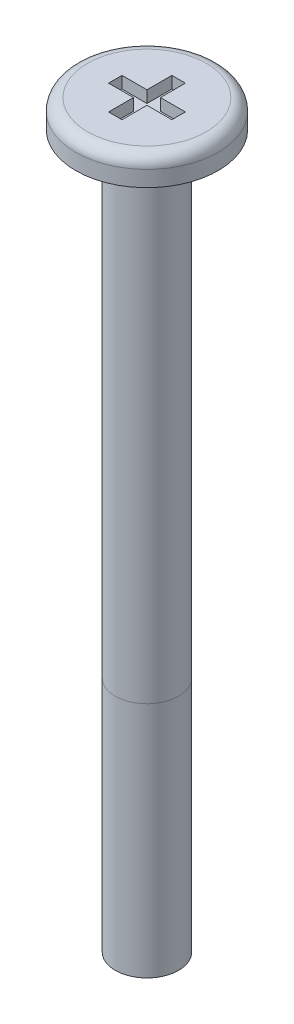
ISO-10303-21;
HEADER;
FILE_DESCRIPTION(('STEP AP214'),'2;1');
FILE_NAME('part.step','',(''),(''),'','','');
FILE_SCHEMA(('AUTOMOTIVE_DESIGN { 1 0 10303 214 1 1 1 1 }'));
ENDSEC;
DATA;
#1=APPLICATION_CONTEXT('core data for automotive mechanical design processes');
#2=APPLICATION_PROTOCOL_DEFINITION('international standard','automotive_design',2000,#1);
#3=PRODUCT_CONTEXT('',#1,'mechanical');
#4=PRODUCT('Part','Part','',(#3));
#5=PRODUCT_RELATED_PRODUCT_CATEGORY('part','',(#4));
#6=PRODUCT_DEFINITION_FORMATION('','',#4);
#7=PRODUCT_DEFINITION_CONTEXT('part definition',#1,'design');
#8=PRODUCT_DEFINITION('design','',#6,#7);
#9=PRODUCT_DEFINITION_SHAPE('','',#8);
#10=(LENGTH_UNIT() NAMED_UNIT(*) SI_UNIT(.MILLI.,.METRE.));
#11=(NAMED_UNIT(*) PLANE_ANGLE_UNIT() SI_UNIT($,.RADIAN.));
#12=(NAMED_UNIT(*) SI_UNIT($,.STERADIAN.) SOLID_ANGLE_UNIT());
#13=UNCERTAINTY_MEASURE_WITH_UNIT(LENGTH_MEASURE(1.E-05),#10,'distance_accuracy_value','');
#14=(GEOMETRIC_REPRESENTATION_CONTEXT(3) GLOBAL_UNCERTAINTY_ASSIGNED_CONTEXT((#13)) GLOBAL_UNIT_ASSIGNED_CONTEXT((#10,
#11,#12)) REPRESENTATION_CONTEXT('',''));
#15=CARTESIAN_POINT('',(0.,0.,0.));
#16=DIRECTION('',(0.,0.,1.));
#17=DIRECTION('',(1.,0.,0.));
#18=AXIS2_PLACEMENT_3D('',#15,#16,#17);
#19=CARTESIAN_POINT('',(0.,45.,0.));
#20=DIRECTION('',(0.,-1.,0.));
#21=DIRECTION('',(0.,0.,-1.));
#22=AXIS2_PLACEMENT_3D('',#19,#20,#21);
#23=CYLINDRICAL_SURFACE('',#22,2.);
#24=CARTESIAN_POINT('',(0.,0.,0.));
#25=DIRECTION('',(0.,1.,0.));
#26=DIRECTION('',(0.,0.,1.));
#27=AXIS2_PLACEMENT_3D('',#24,#25,#26);
#28=CIRCLE('',#27,2.);
#29=CARTESIAN_POINT('',(0.,0.,-2.));
#30=VERTEX_POINT('',#29);
#31=EDGE_CURVE('E213',#30,#30,#28,.T.);
#32=CARTESIAN_POINT('',(0.,15.,0.));
#33=DIRECTION('',(0.,1.,0.));
#34=DIRECTION('',(0.,0.,1.));
#35=AXIS2_PLACEMENT_3D('',#32,#33,#34);
#36=CIRCLE('',#35,2.);
#37=CARTESIAN_POINT('',(0.,15.,-2.));
#38=VERTEX_POINT('',#37);
#39=EDGE_CURVE('E11',#38,#38,#36,.T.);
#40=CARTESIAN_POINT('',(0.,0.,-2.));
#41=CARTESIAN_POINT('',(0.,0.156249999999992,-2.));
#42=CARTESIAN_POINT('',(0.,0.312499999999991,-2.));
#43=CARTESIAN_POINT('',(0.,0.624999999999991,-2.));
#44=CARTESIAN_POINT('',(0.,0.781249999999993,-2.));
#45=CARTESIAN_POINT('',(0.,1.09374999999999,-2.));
#46=CARTESIAN_POINT('',(0.,1.24999999999999,-2.));
#47=CARTESIAN_POINT('',(0.,1.56249999999999,-2.));
#48=CARTESIAN_POINT('',(0.,1.71874999999999,-2.));
#49=CARTESIAN_POINT('',(0.,2.03124999999999,-2.));
#50=CARTESIAN_POINT('',(0.,2.18749999999999,-2.));
#51=CARTESIAN_POINT('',(0.,2.49999999999999,-2.));
#52=CARTESIAN_POINT('',(0.,2.65624999999999,-2.));
#53=CARTESIAN_POINT('',(0.,2.96874999999999,-2.));
#54=CARTESIAN_POINT('',(0.,3.12499999999999,-2.));
#55=CARTESIAN_POINT('',(0.,3.43749999999999,-2.));
#56=CARTESIAN_POINT('',(0.,3.59374999999999,-2.));
#57=CARTESIAN_POINT('',(0.,3.90624999999999,-2.));
#58=CARTESIAN_POINT('',(0.,4.06249999999999,-2.));
#59=CARTESIAN_POINT('',(0.,4.37499999999999,-2.));
#60=CARTESIAN_POINT('',(0.,4.53124999999999,-2.));
#61=CARTESIAN_POINT('',(0.,4.84374999999999,-2.));
#62=CARTESIAN_POINT('',(0.,4.99999999999999,-2.));
#63=CARTESIAN_POINT('',(0.,5.31249999999999,-2.));
#64=CARTESIAN_POINT('',(0.,5.46874999999999,-2.));
#65=CARTESIAN_POINT('',(0.,5.78124999999999,-2.));
#66=CARTESIAN_POINT('',(0.,5.93749999999999,-2.));
#67=CARTESIAN_POINT('',(0.,6.24999999999999,-2.));
#68=CARTESIAN_POINT('',(0.,6.40624999999999,-2.));
#69=CARTESIAN_POINT('',(0.,6.71874999999999,-2.));
#70=CARTESIAN_POINT('',(0.,6.87499999999999,-2.));
#71=CARTESIAN_POINT('',(0.,7.18749999999999,-2.));
#72=CARTESIAN_POINT('',(0.,7.34374999999999,-2.));
#73=CARTESIAN_POINT('',(0.,7.65624999999999,-2.));
#74=CARTESIAN_POINT('',(0.,7.81249999999999,-2.));
#75=CARTESIAN_POINT('',(0.,8.12499999999999,-2.));
#76=CARTESIAN_POINT('',(0.,8.28124999999999,-2.));
#77=CARTESIAN_POINT('',(0.,8.59374999999999,-2.));
#78=CARTESIAN_POINT('',(0.,8.74999999999999,-2.));
#79=CARTESIAN_POINT('',(0.,9.06249999999999,-2.));
#80=CARTESIAN_POINT('',(0.,9.21874999999999,-2.));
#81=CARTESIAN_POINT('',(0.,9.53124999999999,-2.));
#82=CARTESIAN_POINT('',(0.,9.68749999999999,-2.));
#83=CARTESIAN_POINT('',(0.,9.99999999999999,-2.));
#84=CARTESIAN_POINT('',(0.,10.15625,-2.));
#85=CARTESIAN_POINT('',(0.,10.46875,-2.));
#86=CARTESIAN_POINT('',(0.,10.625,-2.));
#87=CARTESIAN_POINT('',(0.,10.9375,-2.));
#88=CARTESIAN_POINT('',(0.,11.09375,-2.));
#89=CARTESIAN_POINT('',(0.,11.40625,-2.));
#90=CARTESIAN_POINT('',(0.,11.5625,-2.));
#91=CARTESIAN_POINT('',(0.,11.875,-2.));
#92=CARTESIAN_POINT('',(0.,12.03125,-2.));
#93=CARTESIAN_POINT('',(0.,12.34375,-2.));
#94=CARTESIAN_POINT('',(0.,12.5,-2.));
#95=CARTESIAN_POINT('',(0.,12.8125,-2.));
#96=CARTESIAN_POINT('',(0.,12.96875,-2.));
#97=CARTESIAN_POINT('',(0.,13.28125,-2.));
#98=CARTESIAN_POINT('',(0.,13.4375,-2.));
#99=CARTESIAN_POINT('',(0.,13.75,-2.));
#100=CARTESIAN_POINT('',(0.,13.90625,-2.));
#101=CARTESIAN_POINT('',(0.,14.21875,-2.));
#102=CARTESIAN_POINT('',(0.,14.375,-2.));
#103=CARTESIAN_POINT('',(0.,14.6875,-2.));
#104=CARTESIAN_POINT('',(0.,14.84375,-2.));
#105=CARTESIAN_POINT('',(0.,15.,-2.));
#106=B_SPLINE_CURVE_WITH_KNOTS('',3,(#40,#41,#42,#43,#44,#45,#46,#47,#48,#49,#50,#51,#52,#53,
#54,#55,#56,#57,#58,#59,#60,#61,#62,#63,#64,#65,#66,#67,#68,#69,#70,#71,#72,#73,#74,#75,#76,#77,
#78,#79,#80,#81,#82,#83,#84,#85,#86,#87,#88,#89,#90,#91,#92,#93,#94,#95,#96,#97,#98,#99,#100,
#101,#102,#103,#104,#105),.UNSPECIFIED.,.F.,.F.,(4,2,2,2,2,2,2,2,2,2,2,2,2,2,2,2,2,2,2,2,2,2,2,
2,2,2,2,2,2,2,2,2,4),(0.,0.468749999999997,0.937500000000001,1.40625,1.875,2.34375,2.8125,
3.28125,3.75,4.21875,4.6875,5.15625,5.625,6.09374999999999,6.5625,7.03125,7.49999999999999,
7.96875,8.43749999999999,8.90625,9.37499999999999,9.84375,10.3125,10.78125,11.25,11.71875,
12.1875,12.65625,13.125,13.59375,14.0625,14.53125,15.),.UNSPECIFIED.);
#107=EDGE_CURVE('BSEAM36',#30,#38,#106,.T.);
#108=ORIENTED_EDGE('',*,*,#31,.T.);
#109=ORIENTED_EDGE('',*,*,#39,.F.);
#110=ORIENTED_EDGE('',*,*,#107,.T.);
#111=ORIENTED_EDGE('',*,*,#107,.F.);
#112=EDGE_LOOP('',(#108,#110,#109,#111));
#113=FACE_BOUND('',#112,.T.);
#114=ADVANCED_FACE('F36',(#113),#23,.T.);
#115=CARTESIAN_POINT('',(0.,45.,0.));
#116=DIRECTION('',(0.,1.,0.));
#117=DIRECTION('',(0.,0.,1.));
#118=AXIS2_PLACEMENT_3D('',#115,#116,#117);
#119=CIRCLE('',#118,2.);
#120=CARTESIAN_POINT('',(0.,45.,-2.));
#121=VERTEX_POINT('',#120);
#122=EDGE_CURVE('E214',#121,#121,#119,.T.);
#123=CARTESIAN_POINT('',(0.,15.,-2.));
#124=CARTESIAN_POINT('',(0.,15.3125,-2.));
#125=CARTESIAN_POINT('',(0.,15.625,-2.));
#126=CARTESIAN_POINT('',(0.,16.25,-2.));
#127=CARTESIAN_POINT('',(0.,16.5625,-2.));
#128=CARTESIAN_POINT('',(0.,17.1875,-2.));
#129=CARTESIAN_POINT('',(0.,17.5,-2.));
#130=CARTESIAN_POINT('',(0.,18.125,-2.));
#131=CARTESIAN_POINT('',(0.,18.4375,-2.));
#132=CARTESIAN_POINT('',(0.,19.0625,-2.));
#133=CARTESIAN_POINT('',(0.,19.375,-2.));
#134=CARTESIAN_POINT('',(0.,20.,-2.));
#135=CARTESIAN_POINT('',(0.,20.3125,-2.));
#136=CARTESIAN_POINT('',(0.,20.9375,-2.));
#137=CARTESIAN_POINT('',(0.,21.25,-2.));
#138=CARTESIAN_POINT('',(0.,21.875,-2.));
#139=CARTESIAN_POINT('',(0.,22.1875,-2.));
#140=CARTESIAN_POINT('',(0.,22.8125,-2.));
#141=CARTESIAN_POINT('',(0.,23.125,-2.));
#142=CARTESIAN_POINT('',(0.,23.75,-2.));
#143=CARTESIAN_POINT('',(0.,24.0625,-2.));
#144=CARTESIAN_POINT('',(0.,24.6875,-2.));
#145=CARTESIAN_POINT('',(0.,25.,-2.));
#146=CARTESIAN_POINT('',(0.,25.625,-2.));
#147=CARTESIAN_POINT('',(0.,25.9375,-2.));
#148=CARTESIAN_POINT('',(0.,26.5625,-2.));
#149=CARTESIAN_POINT('',(0.,26.875,-2.));
#150=CARTESIAN_POINT('',(0.,27.5,-2.));
#151=CARTESIAN_POINT('',(0.,27.8125,-2.));
#152=CARTESIAN_POINT('',(0.,28.4375,-2.));
#153=CARTESIAN_POINT('',(0.,28.75,-2.));
#154=CARTESIAN_POINT('',(0.,29.375,-2.));
#155=CARTESIAN_POINT('',(0.,29.6875,-2.));
#156=CARTESIAN_POINT('',(0.,30.3125,-2.));
#157=CARTESIAN_POINT('',(0.,30.625,-2.));
#158=CARTESIAN_POINT('',(0.,31.25,-2.));
#159=CARTESIAN_POINT('',(0.,31.5625,-2.));
#160=CARTESIAN_POINT('',(0.,32.1875,-2.));
#161=CARTESIAN_POINT('',(0.,32.5,-2.));
#162=CARTESIAN_POINT('',(0.,33.125,-2.));
#163=CARTESIAN_POINT('',(0.,33.4375,-2.));
#164=CARTESIAN_POINT('',(0.,34.0625,-2.));
#165=CARTESIAN_POINT('',(0.,34.375,-2.));
#166=CARTESIAN_POINT('',(0.,35.,-2.));
#167=CARTESIAN_POINT('',(0.,35.3125,-2.));
#168=CARTESIAN_POINT('',(0.,35.9375,-2.));
#169=CARTESIAN_POINT('',(0.,36.25,-2.));
#170=CARTESIAN_POINT('',(0.,36.875,-2.));
#171=CARTESIAN_POINT('',(0.,37.1875,-2.));
#172=CARTESIAN_POINT('',(0.,37.8125,-2.));
#173=CARTESIAN_POINT('',(0.,38.125,-2.));
#174=CARTESIAN_POINT('',(0.,38.75,-2.));
#175=CARTESIAN_POINT('',(0.,39.0625,-2.));
#176=CARTESIAN_POINT('',(0.,39.6875,-2.));
#177=CARTESIAN_POINT('',(0.,40.,-2.));
#178=CARTESIAN_POINT('',(0.,40.625,-2.));
#179=CARTESIAN_POINT('',(0.,40.9375,-2.));
#180=CARTESIAN_POINT('',(0.,41.5625,-2.));
#181=CARTESIAN_POINT('',(0.,41.875,-2.));
#182=CARTESIAN_POINT('',(0.,42.5,-2.));
#183=CARTESIAN_POINT('',(0.,42.8125,-2.));
#184=CARTESIAN_POINT('',(0.,43.4375,-2.));
#185=CARTESIAN_POINT('',(0.,43.75,-2.));
#186=CARTESIAN_POINT('',(0.,44.375,-2.));
#187=CARTESIAN_POINT('',(0.,44.6875,-2.));
#188=CARTESIAN_POINT('',(0.,45.,-2.));
#189=B_SPLINE_CURVE_WITH_KNOTS('',3,(#123,#124,#125,#126,#127,#128,#129,#130,#131,#132,#133,
#134,#135,#136,#137,#138,#139,#140,#141,#142,#143,#144,#145,#146,#147,#148,#149,#150,#151,#152,
#153,#154,#155,#156,#157,#158,#159,#160,#161,#162,#163,#164,#165,#166,#167,#168,#169,#170,#171,
#172,#173,#174,#175,#176,#177,#178,#179,#180,#181,#182,#183,#184,#185,#186,#187,#188),
.UNSPECIFIED.,.F.,.F.,(4,2,2,2,2,2,2,2,2,2,2,2,2,2,2,2,2,2,2,2,2,2,2,2,2,2,2,2,2,2,2,2,4),(0.,
0.937500000000001,1.875,2.8125,3.75,4.6875,5.62500000000001,6.5625,7.5,8.4375,9.37500000000001,
10.3125,11.25,12.1875,13.125,14.0625,15.,15.9375,16.875,17.8125,18.75,19.6875,20.625,21.5625,
22.5,23.4375,24.375,25.3125,26.25,27.1875,28.125,29.0625,30.),.UNSPECIFIED.);
#190=EDGE_CURVE('BSEAM247',#38,#121,#189,.T.);
#191=ORIENTED_EDGE('',*,*,#39,.T.);
#192=ORIENTED_EDGE('',*,*,#122,.F.);
#193=ORIENTED_EDGE('',*,*,#190,.T.);
#194=ORIENTED_EDGE('',*,*,#190,.F.);
#195=EDGE_LOOP('',(#191,#193,#192,#194));
#196=FACE_BOUND('',#195,.T.);
#197=ADVANCED_FACE('F247',(#196),#23,.T.);
#198=CARTESIAN_POINT('',(0.,0.,0.));
#199=DIRECTION('',(0.,1.,0.));
#200=DIRECTION('',(0.,0.,1.));
#201=AXIS2_PLACEMENT_3D('',#198,#199,#200);
#202=PLANE('',#201);
#203=ORIENTED_EDGE('',*,*,#31,.F.);
#204=EDGE_LOOP('',(#203));
#205=FACE_BOUND('',#204,.T.);
#206=ADVANCED_FACE('F243',(#205),#202,.F.);
#207=CARTESIAN_POINT('',(0.,46.75,0.));
#208=DIRECTION('',(0.,-1.,0.));
#209=DIRECTION('',(0.,0.,-1.));
#210=AXIS2_PLACEMENT_3D('',#207,#208,#209);
#211=CYLINDRICAL_SURFACE('',#210,4.5);
#212=CARTESIAN_POINT('',(0.,46.,0.));
#213=DIRECTION('',(0.,1.,0.));
#214=DIRECTION('',(0.,0.,1.));
#215=AXIS2_PLACEMENT_3D('',#212,#213,#214);
#216=CIRCLE('',#215,4.5);
#217=CARTESIAN_POINT('',(0.,46.,4.5));
#218=VERTEX_POINT('',#217);
#219=EDGE_CURVE('E45',#218,#218,#216,.F.);
#220=ORIENTED_EDGE('',*,*,#219,.T.);
#221=EDGE_LOOP('',(#220));
#222=FACE_BOUND('',#221,.T.);
#223=CARTESIAN_POINT('',(0.,45.,0.));
#224=DIRECTION('',(0.,1.,0.));
#225=DIRECTION('',(0.,0.,1.));
#226=AXIS2_PLACEMENT_3D('',#223,#224,#225);
#227=CIRCLE('',#226,4.5);
#228=CARTESIAN_POINT('',(0.,45.,4.5));
#229=VERTEX_POINT('',#228);
#230=EDGE_CURVE('E193',#229,#229,#227,.T.);
#231=ORIENTED_EDGE('',*,*,#230,.T.);
#232=EDGE_LOOP('',(#231));
#233=FACE_BOUND('',#232,.T.);
#234=ADVANCED_FACE('F224',(#222,#233),#211,.T.);
#235=CARTESIAN_POINT('',(0.,46.75,0.));
#236=DIRECTION('',(0.,1.,0.));
#237=DIRECTION('',(0.,0.,1.));
#238=AXIS2_PLACEMENT_3D('',#235,#236,#237);
#239=PLANE('',#238);
#240=DIRECTION('',(1.,0.,0.));
#241=VECTOR('',#240,1.);
#242=CARTESIAN_POINT('',(0.425,46.75,0.425));
#243=LINE('',#242,#241);
#244=CARTESIAN_POINT('',(0.425,46.75,0.425));
#245=VERTEX_POINT('',#244);
#246=CARTESIAN_POINT('',(2.,46.75,0.425));
#247=VERTEX_POINT('',#246);
#248=EDGE_CURVE('E52',#245,#247,#243,.T.);
#249=ORIENTED_EDGE('',*,*,#248,.F.);
#250=DIRECTION('',(0.,0.,-1.));
#251=VECTOR('',#250,1.);
#252=CARTESIAN_POINT('',(0.425,46.75,0.425));
#253=LINE('',#252,#251);
#254=CARTESIAN_POINT('',(0.425,46.75,2.));
#255=VERTEX_POINT('',#254);
#256=EDGE_CURVE('E189',#255,#245,#253,.T.);
#257=ORIENTED_EDGE('',*,*,#256,.F.);
#258=DIRECTION('',(1.,0.,0.));
#259=VECTOR('',#258,1.);
#260=CARTESIAN_POINT('',(-0.425,46.75,2.));
#261=LINE('',#260,#259);
#262=CARTESIAN_POINT('',(-0.425,46.75,2.));
#263=VERTEX_POINT('',#262);
#264=EDGE_CURVE('E187',#263,#255,#261,.T.);
#265=ORIENTED_EDGE('',*,*,#264,.F.);
#266=DIRECTION('',(0.,0.,1.));
#267=VECTOR('',#266,1.);
#268=CARTESIAN_POINT('',(-0.425,46.75,0.425));
#269=LINE('',#268,#267);
#270=CARTESIAN_POINT('',(-0.425,46.75,0.425));
#271=VERTEX_POINT('',#270);
#272=EDGE_CURVE('E136',#271,#263,#269,.T.);
#273=ORIENTED_EDGE('',*,*,#272,.F.);
#274=DIRECTION('',(1.,0.,0.));
#275=VECTOR('',#274,1.);
#276=CARTESIAN_POINT('',(-2.,46.75,0.425));
#277=LINE('',#276,#275);
#278=CARTESIAN_POINT('',(-2.,46.75,0.425));
#279=VERTEX_POINT('',#278);
#280=EDGE_CURVE('E183',#279,#271,#277,.T.);
#281=ORIENTED_EDGE('',*,*,#280,.F.);
#282=DIRECTION('',(0.,0.,1.));
#283=VECTOR('',#282,1.);
#284=CARTESIAN_POINT('',(-2.,46.75,-0.425));
#285=LINE('',#284,#283);
#286=CARTESIAN_POINT('',(-2.,46.75,-0.425));
#287=VERTEX_POINT('',#286);
#288=EDGE_CURVE('E180',#287,#279,#285,.T.);
#289=ORIENTED_EDGE('',*,*,#288,.F.);
#290=DIRECTION('',(-1.,0.,0.));
#291=VECTOR('',#290,1.);
#292=CARTESIAN_POINT('',(-2.,46.75,-0.425));
#293=LINE('',#292,#291);
#294=CARTESIAN_POINT('',(-0.425,46.75,-0.425));
#295=VERTEX_POINT('',#294);
#296=EDGE_CURVE('E177',#295,#287,#293,.T.);
#297=ORIENTED_EDGE('',*,*,#296,.F.);
#298=DIRECTION('',(0.,0.,1.));
#299=VECTOR('',#298,1.);
#300=CARTESIAN_POINT('',(-0.425,46.75,-2.));
#301=LINE('',#300,#299);
#302=CARTESIAN_POINT('',(-0.425,46.75,-2.));
#303=VERTEX_POINT('',#302);
#304=EDGE_CURVE('E174',#303,#295,#301,.T.);
#305=ORIENTED_EDGE('',*,*,#304,.F.);
#306=DIRECTION('',(-1.,0.,0.));
#307=VECTOR('',#306,1.);
#308=CARTESIAN_POINT('',(-0.425,46.75,-2.));
#309=LINE('',#308,#307);
#310=CARTESIAN_POINT('',(0.425,46.75,-2.));
#311=VERTEX_POINT('',#310);
#312=EDGE_CURVE('E171',#311,#303,#309,.T.);
#313=ORIENTED_EDGE('',*,*,#312,.F.);
#314=DIRECTION('',(0.,0.,-1.));
#315=VECTOR('',#314,1.);
#316=CARTESIAN_POINT('',(0.425,46.75,-2.));
#317=LINE('',#316,#315);
#318=CARTESIAN_POINT('',(0.425,46.75,-0.425));
#319=VERTEX_POINT('',#318);
#320=EDGE_CURVE('E168',#319,#311,#317,.T.);
#321=ORIENTED_EDGE('',*,*,#320,.F.);
#322=DIRECTION('',(-1.,0.,0.));
#323=VECTOR('',#322,1.);
#324=CARTESIAN_POINT('',(0.425,46.75,-0.425));
#325=LINE('',#324,#323);
#326=CARTESIAN_POINT('',(2.,46.75,-0.425));
#327=VERTEX_POINT('',#326);
#328=EDGE_CURVE('E165',#327,#319,#325,.T.);
#329=ORIENTED_EDGE('',*,*,#328,.F.);
#330=DIRECTION('',(0.,0.,-1.));
#331=VECTOR('',#330,1.);
#332=CARTESIAN_POINT('',(2.,46.75,-0.425));
#333=LINE('',#332,#331);
#334=EDGE_CURVE('E162',#247,#327,#333,.T.);
#335=ORIENTED_EDGE('',*,*,#334,.F.);
#336=EDGE_LOOP('',(#249,#257,#265,#273,#281,#289,#297,#305,#313,#321,#329,#335));
#337=FACE_BOUND('',#336,.T.);
#338=CARTESIAN_POINT('',(0.,46.75,0.));
#339=DIRECTION('',(0.,1.,0.));
#340=DIRECTION('',(0.,0.,1.));
#341=AXIS2_PLACEMENT_3D('',#338,#339,#340);
#342=CIRCLE('',#341,3.75);
#343=CARTESIAN_POINT('',(0.,46.75,3.75));
#344=VERTEX_POINT('',#343);
#345=EDGE_CURVE('E217',#344,#344,#342,.T.);
#346=ORIENTED_EDGE('',*,*,#345,.T.);
#347=EDGE_LOOP('',(#346));
#348=FACE_BOUND('',#347,.T.);
#349=ADVANCED_FACE('F233',(#337,#348),#239,.T.);
#350=CARTESIAN_POINT('',(0.,45.,0.));
#351=DIRECTION('',(0.,1.,0.));
#352=DIRECTION('',(0.,0.,1.));
#353=AXIS2_PLACEMENT_3D('',#350,#351,#352);
#354=PLANE('',#353);
#355=ORIENTED_EDGE('',*,*,#122,.T.);
#356=EDGE_LOOP('',(#355));
#357=FACE_BOUND('',#356,.T.);
#358=ORIENTED_EDGE('',*,*,#230,.F.);
#359=EDGE_LOOP('',(#358));
#360=FACE_BOUND('',#359,.T.);
#361=ADVANCED_FACE('F230',(#357,#360),#354,.F.);
#362=CARTESIAN_POINT('',(0.,46.,0.));
#363=DIRECTION('',(0.,1.,0.));
#364=DIRECTION('',(0.,0.,1.));
#365=AXIS2_PLACEMENT_3D('',#362,#363,#364);
#366=TOROIDAL_SURFACE('',#365,3.75,0.75);
#367=ORIENTED_EDGE('',*,*,#219,.F.);
#368=EDGE_LOOP('',(#367));
#369=FACE_BOUND('',#368,.T.);
#370=ORIENTED_EDGE('',*,*,#345,.F.);
#371=EDGE_LOOP('',(#370));
#372=FACE_BOUND('',#371,.T.);
#373=ADVANCED_FACE('F38',(#369,#372),#366,.T.);
#374=CARTESIAN_POINT('',(0.425,46.,0.425));
#375=DIRECTION('',(0.,0.,1.));
#376=DIRECTION('',(1.,0.,0.));
#377=AXIS2_PLACEMENT_3D('',#374,#375,#376);
#378=PLANE('',#377);
#379=ORIENTED_EDGE('',*,*,#248,.T.);
#380=DIRECTION('',(0.,1.,0.));
#381=VECTOR('',#380,1.);
#382=CARTESIAN_POINT('',(2.,46.,0.425));
#383=LINE('',#382,#381);
#384=CARTESIAN_POINT('',(2.,46.,0.425));
#385=VERTEX_POINT('',#384);
#386=EDGE_CURVE('E100',#385,#247,#383,.T.);
#387=ORIENTED_EDGE('',*,*,#386,.F.);
#388=DIRECTION('',(1.,0.,0.));
#389=VECTOR('',#388,1.);
#390=CARTESIAN_POINT('',(0.425,46.,0.425));
#391=LINE('',#390,#389);
#392=CARTESIAN_POINT('',(0.425,46.,0.425));
#393=VERTEX_POINT('',#392);
#394=EDGE_CURVE('E191',#393,#385,#391,.T.);
#395=ORIENTED_EDGE('',*,*,#394,.F.);
#396=DIRECTION('',(0.,1.,0.));
#397=VECTOR('',#396,1.);
#398=CARTESIAN_POINT('',(0.425,46.,0.425));
#399=LINE('',#398,#397);
#400=EDGE_CURVE('E60',#393,#245,#399,.T.);
#401=ORIENTED_EDGE('',*,*,#400,.T.);
#402=EDGE_LOOP('',(#379,#387,#395,#401));
#403=FACE_BOUND('',#402,.T.);
#404=ADVANCED_FACE('F229',(#403),#378,.F.);
#405=CARTESIAN_POINT('',(0.425,46.,0.425));
#406=DIRECTION('',(1.,0.,0.));
#407=DIRECTION('',(0.,0.,-1.));
#408=AXIS2_PLACEMENT_3D('',#405,#406,#407);
#409=PLANE('',#408);
#410=ORIENTED_EDGE('',*,*,#256,.T.);
#411=ORIENTED_EDGE('',*,*,#400,.F.);
#412=DIRECTION('',(0.,0.,-1.));
#413=VECTOR('',#412,1.);
#414=CARTESIAN_POINT('',(0.425,46.,0.425));
#415=LINE('',#414,#413);
#416=CARTESIAN_POINT('',(0.425,46.,2.));
#417=VERTEX_POINT('',#416);
#418=EDGE_CURVE('E148',#417,#393,#415,.T.);
#419=ORIENTED_EDGE('',*,*,#418,.F.);
#420=DIRECTION('',(0.,1.,0.));
#421=VECTOR('',#420,1.);
#422=CARTESIAN_POINT('',(0.425,46.,2.));
#423=LINE('',#422,#421);
#424=EDGE_CURVE('E140',#417,#255,#423,.T.);
#425=ORIENTED_EDGE('',*,*,#424,.T.);
#426=EDGE_LOOP('',(#410,#411,#419,#425));
#427=FACE_BOUND('',#426,.T.);
#428=ADVANCED_FACE('F288',(#427),#409,.F.);
#429=CARTESIAN_POINT('',(-0.425,46.,2.));
#430=DIRECTION('',(0.,0.,1.));
#431=DIRECTION('',(1.,0.,0.));
#432=AXIS2_PLACEMENT_3D('',#429,#430,#431);
#433=PLANE('',#432);
#434=ORIENTED_EDGE('',*,*,#264,.T.);
#435=ORIENTED_EDGE('',*,*,#424,.F.);
#436=DIRECTION('',(1.,0.,0.));
#437=VECTOR('',#436,1.);
#438=CARTESIAN_POINT('',(-0.425,46.,2.));
#439=LINE('',#438,#437);
#440=CARTESIAN_POINT('',(-0.425,46.,2.));
#441=VERTEX_POINT('',#440);
#442=EDGE_CURVE('E144',#441,#417,#439,.T.);
#443=ORIENTED_EDGE('',*,*,#442,.F.);
#444=DIRECTION('',(0.,1.,0.));
#445=VECTOR('',#444,1.);
#446=CARTESIAN_POINT('',(-0.425,46.,2.));
#447=LINE('',#446,#445);
#448=EDGE_CURVE('E129',#441,#263,#447,.T.);
#449=ORIENTED_EDGE('',*,*,#448,.T.);
#450=EDGE_LOOP('',(#434,#435,#443,#449));
#451=FACE_BOUND('',#450,.T.);
#452=ADVANCED_FACE('F145',(#451),#433,.F.);
#453=CARTESIAN_POINT('',(-0.425,46.,0.425));
#454=DIRECTION('',(-1.,0.,0.));
#455=DIRECTION('',(0.,0.,1.));
#456=AXIS2_PLACEMENT_3D('',#453,#454,#455);
#457=PLANE('',#456);
#458=ORIENTED_EDGE('',*,*,#272,.T.);
#459=ORIENTED_EDGE('',*,*,#448,.F.);
#460=DIRECTION('',(0.,0.,1.));
#461=VECTOR('',#460,1.);
#462=CARTESIAN_POINT('',(-0.425,46.,0.425));
#463=LINE('',#462,#461);
#464=CARTESIAN_POINT('',(-0.425,46.,0.425));
#465=VERTEX_POINT('',#464);
#466=EDGE_CURVE('E133',#465,#441,#463,.T.);
#467=ORIENTED_EDGE('',*,*,#466,.F.);
#468=DIRECTION('',(0.,1.,0.));
#469=VECTOR('',#468,1.);
#470=CARTESIAN_POINT('',(-0.425,46.,0.425));
#471=LINE('',#470,#469);
#472=EDGE_CURVE('E141',#465,#271,#471,.T.);
#473=ORIENTED_EDGE('',*,*,#472,.T.);
#474=EDGE_LOOP('',(#458,#459,#467,#473));
#475=FACE_BOUND('',#474,.T.);
#476=ADVANCED_FACE('F131',(#475),#457,.F.);
#477=CARTESIAN_POINT('',(-2.,46.,0.425));
#478=DIRECTION('',(0.,0.,1.));
#479=DIRECTION('',(1.,0.,0.));
#480=AXIS2_PLACEMENT_3D('',#477,#478,#479);
#481=PLANE('',#480);
#482=ORIENTED_EDGE('',*,*,#280,.T.);
#483=ORIENTED_EDGE('',*,*,#472,.F.);
#484=DIRECTION('',(1.,0.,0.));
#485=VECTOR('',#484,1.);
#486=CARTESIAN_POINT('',(-2.,46.,0.425));
#487=LINE('',#486,#485);
#488=CARTESIAN_POINT('',(-2.,46.,0.425));
#489=VERTEX_POINT('',#488);
#490=EDGE_CURVE('E154',#489,#465,#487,.T.);
#491=ORIENTED_EDGE('',*,*,#490,.F.);
#492=DIRECTION('',(0.,1.,0.));
#493=VECTOR('',#492,1.);
#494=CARTESIAN_POINT('',(-2.,46.,0.425));
#495=LINE('',#494,#493);
#496=EDGE_CURVE('E196',#489,#279,#495,.T.);
#497=ORIENTED_EDGE('',*,*,#496,.T.);
#498=EDGE_LOOP('',(#482,#483,#491,#497));
#499=FACE_BOUND('',#498,.T.);
#500=ADVANCED_FACE('F312',(#499),#481,.F.);
#501=CARTESIAN_POINT('',(-2.,46.,-0.425));
#502=DIRECTION('',(-1.,0.,0.));
#503=DIRECTION('',(0.,0.,1.));
#504=AXIS2_PLACEMENT_3D('',#501,#502,#503);
#505=PLANE('',#504);
#506=ORIENTED_EDGE('',*,*,#288,.T.);
#507=ORIENTED_EDGE('',*,*,#496,.F.);
#508=DIRECTION('',(0.,0.,1.));
#509=VECTOR('',#508,1.);
#510=CARTESIAN_POINT('',(-2.,46.,-0.425));
#511=LINE('',#510,#509);
#512=CARTESIAN_POINT('',(-2.,46.,-0.425));
#513=VERTEX_POINT('',#512);
#514=EDGE_CURVE('E156',#513,#489,#511,.T.);
#515=ORIENTED_EDGE('',*,*,#514,.F.);
#516=DIRECTION('',(0.,1.,0.));
#517=VECTOR('',#516,1.);
#518=CARTESIAN_POINT('',(-2.,46.,-0.425));
#519=LINE('',#518,#517);
#520=EDGE_CURVE('E198',#513,#287,#519,.T.);
#521=ORIENTED_EDGE('',*,*,#520,.T.);
#522=EDGE_LOOP('',(#506,#507,#515,#521));
#523=FACE_BOUND('',#522,.T.);
#524=ADVANCED_FACE('F321',(#523),#505,.F.);
#525=CARTESIAN_POINT('',(-2.,46.,-0.425));
#526=DIRECTION('',(0.,0.,-1.));
#527=DIRECTION('',(-1.,0.,0.));
#528=AXIS2_PLACEMENT_3D('',#525,#526,#527);
#529=PLANE('',#528);
#530=ORIENTED_EDGE('',*,*,#296,.T.);
#531=ORIENTED_EDGE('',*,*,#520,.F.);
#532=DIRECTION('',(-1.,0.,0.));
#533=VECTOR('',#532,1.);
#534=CARTESIAN_POINT('',(-2.,46.,-0.425));
#535=LINE('',#534,#533);
#536=CARTESIAN_POINT('',(-0.425,46.,-0.425));
#537=VERTEX_POINT('',#536);
#538=EDGE_CURVE('E442',#537,#513,#535,.T.);
#539=ORIENTED_EDGE('',*,*,#538,.F.);
#540=DIRECTION('',(0.,1.,0.));
#541=VECTOR('',#540,1.);
#542=CARTESIAN_POINT('',(-0.425,46.,-0.425));
#543=LINE('',#542,#541);
#544=EDGE_CURVE('E200',#537,#295,#543,.T.);
#545=ORIENTED_EDGE('',*,*,#544,.T.);
#546=EDGE_LOOP('',(#530,#531,#539,#545));
#547=FACE_BOUND('',#546,.T.);
#548=ADVANCED_FACE('F331',(#547),#529,.F.);
#549=CARTESIAN_POINT('',(-0.425,46.,-2.));
#550=DIRECTION('',(-1.,0.,0.));
#551=DIRECTION('',(0.,0.,1.));
#552=AXIS2_PLACEMENT_3D('',#549,#550,#551);
#553=PLANE('',#552);
#554=ORIENTED_EDGE('',*,*,#304,.T.);
#555=ORIENTED_EDGE('',*,*,#544,.F.);
#556=DIRECTION('',(0.,0.,1.));
#557=VECTOR('',#556,1.);
#558=CARTESIAN_POINT('',(-0.425,46.,-2.));
#559=LINE('',#558,#557);
#560=CARTESIAN_POINT('',(-0.425,46.,-2.));
#561=VERTEX_POINT('',#560);
#562=EDGE_CURVE('E439',#561,#537,#559,.T.);
#563=ORIENTED_EDGE('',*,*,#562,.F.);
#564=DIRECTION('',(0.,1.,0.));
#565=VECTOR('',#564,1.);
#566=CARTESIAN_POINT('',(-0.425,46.,-2.));
#567=LINE('',#566,#565);
#568=EDGE_CURVE('E202',#561,#303,#567,.T.);
#569=ORIENTED_EDGE('',*,*,#568,.T.);
#570=EDGE_LOOP('',(#554,#555,#563,#569));
#571=FACE_BOUND('',#570,.T.);
#572=ADVANCED_FACE('F341',(#571),#553,.F.);
#573=CARTESIAN_POINT('',(-0.425,46.,-2.));
#574=DIRECTION('',(0.,0.,-1.));
#575=DIRECTION('',(-1.,0.,0.));
#576=AXIS2_PLACEMENT_3D('',#573,#574,#575);
#577=PLANE('',#576);
#578=ORIENTED_EDGE('',*,*,#312,.T.);
#579=ORIENTED_EDGE('',*,*,#568,.F.);
#580=DIRECTION('',(-1.,0.,0.));
#581=VECTOR('',#580,1.);
#582=CARTESIAN_POINT('',(-0.425,46.,-2.));
#583=LINE('',#582,#581);
#584=CARTESIAN_POINT('',(0.425,46.,-2.));
#585=VERTEX_POINT('',#584);
#586=EDGE_CURVE('E436',#585,#561,#583,.T.);
#587=ORIENTED_EDGE('',*,*,#586,.F.);
#588=DIRECTION('',(0.,1.,0.));
#589=VECTOR('',#588,1.);
#590=CARTESIAN_POINT('',(0.425,46.,-2.));
#591=LINE('',#590,#589);
#592=EDGE_CURVE('E204',#585,#311,#591,.T.);
#593=ORIENTED_EDGE('',*,*,#592,.T.);
#594=EDGE_LOOP('',(#578,#579,#587,#593));
#595=FACE_BOUND('',#594,.T.);
#596=ADVANCED_FACE('F351',(#595),#577,.F.);
#597=CARTESIAN_POINT('',(0.425,46.,-2.));
#598=DIRECTION('',(1.,0.,0.));
#599=DIRECTION('',(0.,0.,-1.));
#600=AXIS2_PLACEMENT_3D('',#597,#598,#599);
#601=PLANE('',#600);
#602=ORIENTED_EDGE('',*,*,#320,.T.);
#603=ORIENTED_EDGE('',*,*,#592,.F.);
#604=DIRECTION('',(0.,0.,-1.));
#605=VECTOR('',#604,1.);
#606=CARTESIAN_POINT('',(0.425,46.,-2.));
#607=LINE('',#606,#605);
#608=CARTESIAN_POINT('',(0.425,46.,-0.425));
#609=VERTEX_POINT('',#608);
#610=EDGE_CURVE('E429',#609,#585,#607,.T.);
#611=ORIENTED_EDGE('',*,*,#610,.F.);
#612=DIRECTION('',(0.,1.,0.));
#613=VECTOR('',#612,1.);
#614=CARTESIAN_POINT('',(0.425,46.,-0.425));
#615=LINE('',#614,#613);
#616=EDGE_CURVE('E206',#609,#319,#615,.T.);
#617=ORIENTED_EDGE('',*,*,#616,.T.);
#618=EDGE_LOOP('',(#602,#603,#611,#617));
#619=FACE_BOUND('',#618,.T.);
#620=ADVANCED_FACE('F361',(#619),#601,.F.);
#621=CARTESIAN_POINT('',(0.425,46.,-0.425));
#622=DIRECTION('',(0.,0.,-1.));
#623=DIRECTION('',(-1.,0.,0.));
#624=AXIS2_PLACEMENT_3D('',#621,#622,#623);
#625=PLANE('',#624);
#626=ORIENTED_EDGE('',*,*,#328,.T.);
#627=ORIENTED_EDGE('',*,*,#616,.F.);
#628=DIRECTION('',(-1.,0.,0.));
#629=VECTOR('',#628,1.);
#630=CARTESIAN_POINT('',(0.425,46.,-0.425));
#631=LINE('',#630,#629);
#632=CARTESIAN_POINT('',(2.,46.,-0.425));
#633=VERTEX_POINT('',#632);
#634=EDGE_CURVE('E426',#633,#609,#631,.T.);
#635=ORIENTED_EDGE('',*,*,#634,.F.);
#636=DIRECTION('',(0.,1.,0.));
#637=VECTOR('',#636,1.);
#638=CARTESIAN_POINT('',(2.,46.,-0.425));
#639=LINE('',#638,#637);
#640=EDGE_CURVE('E208',#633,#327,#639,.T.);
#641=ORIENTED_EDGE('',*,*,#640,.T.);
#642=EDGE_LOOP('',(#626,#627,#635,#641));
#643=FACE_BOUND('',#642,.T.);
#644=ADVANCED_FACE('F371',(#643),#625,.F.);
#645=CARTESIAN_POINT('',(2.,46.,-0.425));
#646=DIRECTION('',(1.,0.,0.));
#647=DIRECTION('',(0.,0.,-1.));
#648=AXIS2_PLACEMENT_3D('',#645,#646,#647);
#649=PLANE('',#648);
#650=ORIENTED_EDGE('',*,*,#334,.T.);
#651=ORIENTED_EDGE('',*,*,#640,.F.);
#652=DIRECTION('',(0.,0.,-1.));
#653=VECTOR('',#652,1.);
#654=CARTESIAN_POINT('',(2.,46.,-0.425));
#655=LINE('',#654,#653);
#656=EDGE_CURVE('E430',#385,#633,#655,.T.);
#657=ORIENTED_EDGE('',*,*,#656,.F.);
#658=ORIENTED_EDGE('',*,*,#386,.T.);
#659=EDGE_LOOP('',(#650,#651,#657,#658));
#660=FACE_BOUND('',#659,.T.);
#661=ADVANCED_FACE('F381',(#660),#649,.F.);
#662=CARTESIAN_POINT('',(0.,46.,0.));
#663=DIRECTION('',(0.,-1.,0.));
#664=DIRECTION('',(0.,0.,-1.));
#665=AXIS2_PLACEMENT_3D('',#662,#663,#664);
#666=PLANE('',#665);
#667=ORIENTED_EDGE('',*,*,#394,.T.);
#668=ORIENTED_EDGE('',*,*,#656,.T.);
#669=ORIENTED_EDGE('',*,*,#634,.T.);
#670=ORIENTED_EDGE('',*,*,#610,.T.);
#671=ORIENTED_EDGE('',*,*,#586,.T.);
#672=ORIENTED_EDGE('',*,*,#562,.T.);
#673=ORIENTED_EDGE('',*,*,#538,.T.);
#674=ORIENTED_EDGE('',*,*,#514,.T.);
#675=ORIENTED_EDGE('',*,*,#490,.T.);
#676=ORIENTED_EDGE('',*,*,#466,.T.);
#677=ORIENTED_EDGE('',*,*,#442,.T.);
#678=ORIENTED_EDGE('',*,*,#418,.T.);
#679=EDGE_LOOP('',(#667,#668,#669,#670,#671,#672,#673,#674,#675,#676,#677,#678));
#680=FACE_BOUND('',#679,.T.);
#681=ADVANCED_FACE('F151',(#680),#666,.F.);
#682=CLOSED_SHELL('',(#114,#197,#206,#234,#349,#361,#373,#404,#428,#452,#476,#500,#524,#548,
#572,#596,#620,#644,#661,#681));
#683=MANIFOLD_SOLID_BREP('B2',#682);
#684=ADVANCED_BREP_SHAPE_REPRESENTATION('',(#18,#683),#14);
#685=SHAPE_DEFINITION_REPRESENTATION(#9,#684);
ENDSEC;
END-ISO-10303-21;
